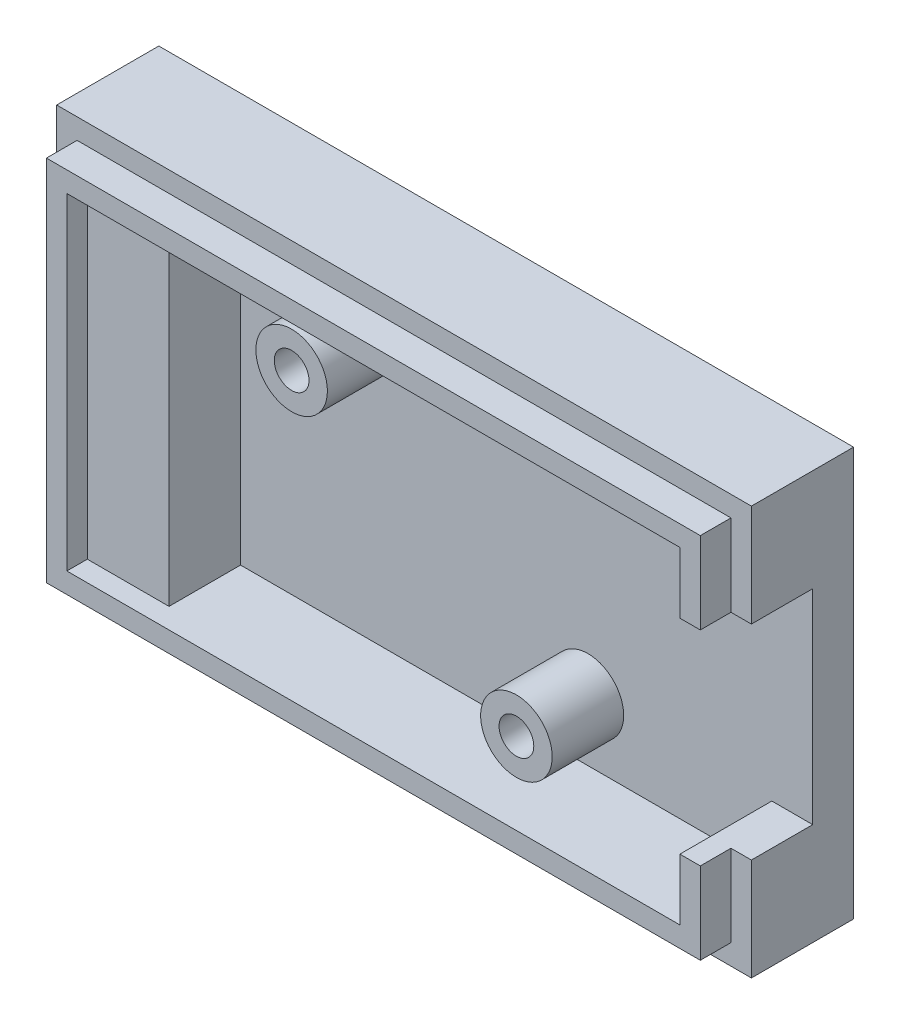
ISO-10303-21;
HEADER;
FILE_DESCRIPTION(('STEP AP214'),'2;1');
FILE_NAME('part.step','',(''),(''),'','','');
FILE_SCHEMA(('AUTOMOTIVE_DESIGN { 1 0 10303 214 1 1 1 1 }'));
ENDSEC;
DATA;
#1=APPLICATION_CONTEXT('core data for automotive mechanical design processes');
#2=APPLICATION_PROTOCOL_DEFINITION('international standard','automotive_design',2000,#1);
#3=PRODUCT_CONTEXT('',#1,'mechanical');
#4=PRODUCT('Part','Part','',(#3));
#5=PRODUCT_RELATED_PRODUCT_CATEGORY('part','',(#4));
#6=PRODUCT_DEFINITION_FORMATION('','',#4);
#7=PRODUCT_DEFINITION_CONTEXT('part definition',#1,'design');
#8=PRODUCT_DEFINITION('design','',#6,#7);
#9=PRODUCT_DEFINITION_SHAPE('','',#8);
#10=(LENGTH_UNIT() NAMED_UNIT(*) SI_UNIT(.MILLI.,.METRE.));
#11=(NAMED_UNIT(*) PLANE_ANGLE_UNIT() SI_UNIT($,.RADIAN.));
#12=(NAMED_UNIT(*) SI_UNIT($,.STERADIAN.) SOLID_ANGLE_UNIT());
#13=UNCERTAINTY_MEASURE_WITH_UNIT(LENGTH_MEASURE(1.E-05),#10,'distance_accuracy_value','');
#14=(GEOMETRIC_REPRESENTATION_CONTEXT(3) GLOBAL_UNCERTAINTY_ASSIGNED_CONTEXT((#13)) GLOBAL_UNIT_ASSIGNED_CONTEXT((#10,
#11,#12)) REPRESENTATION_CONTEXT('',''));
#15=CARTESIAN_POINT('',(0.,0.,0.));
#16=DIRECTION('',(0.,0.,1.));
#17=DIRECTION('',(1.,0.,0.));
#18=AXIS2_PLACEMENT_3D('',#15,#16,#17);
#19=CARTESIAN_POINT('',(6.,-5.,0.));
#20=DIRECTION('',(0.,0.,1.));
#21=DIRECTION('',(1.,0.,0.));
#22=AXIS2_PLACEMENT_3D('',#19,#20,#21);
#23=CYLINDRICAL_SURFACE('',#22,0.85);
#24=CARTESIAN_POINT('',(6.,-5.,5.5));
#25=DIRECTION('',(0.,0.,1.));
#26=DIRECTION('',(1.,0.,0.));
#27=AXIS2_PLACEMENT_3D('',#24,#25,#26);
#28=CIRCLE('',#27,0.85);
#29=CARTESIAN_POINT('',(6.85,-5.,5.5));
#30=VERTEX_POINT('',#29);
#31=EDGE_CURVE('E250',#30,#30,#28,.T.);
#32=ORIENTED_EDGE('',*,*,#31,.T.);
#33=EDGE_LOOP('',(#32));
#34=FACE_BOUND('',#33,.T.);
#35=CARTESIAN_POINT('',(6.,-5.,1.));
#36=DIRECTION('',(0.,0.,-1.));
#37=DIRECTION('',(-1.,0.,0.));
#38=AXIS2_PLACEMENT_3D('',#35,#36,#37);
#39=CIRCLE('',#38,0.85);
#40=CARTESIAN_POINT('',(5.15,-5.,1.));
#41=VERTEX_POINT('',#40);
#42=EDGE_CURVE('E42',#41,#41,#39,.F.);
#43=ORIENTED_EDGE('',*,*,#42,.F.);
#44=EDGE_LOOP('',(#43));
#45=FACE_BOUND('',#44,.T.);
#46=ADVANCED_FACE('F38',(#34,#45),#23,.F.);
#47=CARTESIAN_POINT('',(-5.,5.,0.));
#48=DIRECTION('',(0.,0.,1.));
#49=DIRECTION('',(1.,0.,0.));
#50=AXIS2_PLACEMENT_3D('',#47,#48,#49);
#51=CYLINDRICAL_SURFACE('',#50,0.85);
#52=CARTESIAN_POINT('',(-5.,5.,5.5));
#53=DIRECTION('',(0.,0.,1.));
#54=DIRECTION('',(1.,0.,0.));
#55=AXIS2_PLACEMENT_3D('',#52,#53,#54);
#56=CIRCLE('',#55,0.85);
#57=CARTESIAN_POINT('',(-4.15,5.,5.5));
#58=VERTEX_POINT('',#57);
#59=EDGE_CURVE('E268',#58,#58,#56,.T.);
#60=ORIENTED_EDGE('',*,*,#59,.T.);
#61=EDGE_LOOP('',(#60));
#62=FACE_BOUND('',#61,.T.);
#63=CARTESIAN_POINT('',(-5.,5.,1.));
#64=DIRECTION('',(0.,0.,-1.));
#65=DIRECTION('',(-1.,0.,0.));
#66=AXIS2_PLACEMENT_3D('',#63,#64,#65);
#67=CIRCLE('',#66,0.85);
#68=CARTESIAN_POINT('',(-5.85,5.,1.));
#69=VERTEX_POINT('',#68);
#70=EDGE_CURVE('E241',#69,#69,#67,.F.);
#71=ORIENTED_EDGE('',*,*,#70,.F.);
#72=EDGE_LOOP('',(#71));
#73=FACE_BOUND('',#72,.T.);
#74=ADVANCED_FACE('F492',(#62,#73),#51,.F.);
#75=CARTESIAN_POINT('',(-15.,-8.,2.));
#76=DIRECTION('',(0.,-1.,0.));
#77=DIRECTION('',(0.,0.,-1.));
#78=AXIS2_PLACEMENT_3D('',#75,#76,#77);
#79=PLANE('',#78);
#80=DIRECTION('',(0.,0.,-1.));
#81=VECTOR('',#80,1.);
#82=CARTESIAN_POINT('',(-11.,-8.,5.5));
#83=LINE('',#82,#81);
#84=CARTESIAN_POINT('',(-11.,-8.,5.5));
#85=VERTEX_POINT('',#84);
#86=CARTESIAN_POINT('',(-11.,-8.,2.));
#87=VERTEX_POINT('',#86);
#88=EDGE_CURVE('E56',#85,#87,#83,.T.);
#89=ORIENTED_EDGE('',*,*,#88,.F.);
#90=DIRECTION('',(1.,0.,0.));
#91=VECTOR('',#90,1.);
#92=CARTESIAN_POINT('',(-15.,-8.,5.5));
#93=LINE('',#92,#91);
#94=CARTESIAN_POINT('',(-15.,-8.,5.5));
#95=VERTEX_POINT('',#94);
#96=EDGE_CURVE('E181',#95,#85,#93,.T.);
#97=ORIENTED_EDGE('',*,*,#96,.F.);
#98=DIRECTION('',(0.,0.,1.));
#99=VECTOR('',#98,1.);
#100=CARTESIAN_POINT('',(-15.,-8.,2.));
#101=LINE('',#100,#99);
#102=CARTESIAN_POINT('',(-15.,-8.,6.5));
#103=VERTEX_POINT('',#102);
#104=EDGE_CURVE('E193',#95,#103,#101,.T.);
#105=ORIENTED_EDGE('',*,*,#104,.T.);
#106=DIRECTION('',(1.,0.,0.));
#107=VECTOR('',#106,1.);
#108=CARTESIAN_POINT('',(-15.,-8.,6.5));
#109=LINE('',#108,#107);
#110=CARTESIAN_POINT('',(15.,-8.,6.5));
#111=VERTEX_POINT('',#110);
#112=EDGE_CURVE('E436',#103,#111,#109,.T.);
#113=ORIENTED_EDGE('',*,*,#112,.T.);
#114=DIRECTION('',(0.,0.,1.));
#115=VECTOR('',#114,1.);
#116=CARTESIAN_POINT('',(15.,-8.,2.));
#117=LINE('',#116,#115);
#118=CARTESIAN_POINT('',(15.,-8.,2.));
#119=VERTEX_POINT('',#118);
#120=EDGE_CURVE('E204',#119,#111,#117,.T.);
#121=ORIENTED_EDGE('',*,*,#120,.F.);
#122=DIRECTION('',(1.,0.,0.));
#123=VECTOR('',#122,1.);
#124=CARTESIAN_POINT('',(-15.,-8.,2.));
#125=LINE('',#124,#123);
#126=EDGE_CURVE('E218',#87,#119,#125,.T.);
#127=ORIENTED_EDGE('',*,*,#126,.F.);
#128=EDGE_LOOP('',(#89,#97,#105,#113,#121,#127));
#129=FACE_BOUND('',#128,.T.);
#130=ADVANCED_FACE('F191',(#129),#79,.F.);
#131=CARTESIAN_POINT('',(-15.,8.,2.));
#132=DIRECTION('',(0.,1.,0.));
#133=DIRECTION('',(0.,0.,1.));
#134=AXIS2_PLACEMENT_3D('',#131,#132,#133);
#135=PLANE('',#134);
#136=DIRECTION('',(0.,0.,-1.));
#137=VECTOR('',#136,1.);
#138=CARTESIAN_POINT('',(-11.,8.,5.5));
#139=LINE('',#138,#137);
#140=CARTESIAN_POINT('',(-11.,8.,5.5));
#141=VERTEX_POINT('',#140);
#142=CARTESIAN_POINT('',(-11.,8.,2.));
#143=VERTEX_POINT('',#142);
#144=EDGE_CURVE('E295',#141,#143,#139,.T.);
#145=ORIENTED_EDGE('',*,*,#144,.T.);
#146=DIRECTION('',(-1.,0.,0.));
#147=VECTOR('',#146,1.);
#148=CARTESIAN_POINT('',(-15.,8.,2.));
#149=LINE('',#148,#147);
#150=CARTESIAN_POINT('',(15.,8.,2.));
#151=VERTEX_POINT('',#150);
#152=EDGE_CURVE('E420',#151,#143,#149,.T.);
#153=ORIENTED_EDGE('',*,*,#152,.F.);
#154=DIRECTION('',(0.,0.,1.));
#155=VECTOR('',#154,1.);
#156=CARTESIAN_POINT('',(15.,8.,2.));
#157=LINE('',#156,#155);
#158=CARTESIAN_POINT('',(15.,8.,6.5));
#159=VERTEX_POINT('',#158);
#160=EDGE_CURVE('E211',#151,#159,#157,.T.);
#161=ORIENTED_EDGE('',*,*,#160,.T.);
#162=DIRECTION('',(-1.,0.,0.));
#163=VECTOR('',#162,1.);
#164=CARTESIAN_POINT('',(-15.,8.,6.5));
#165=LINE('',#164,#163);
#166=CARTESIAN_POINT('',(-15.,8.,6.5));
#167=VERTEX_POINT('',#166);
#168=EDGE_CURVE('E431',#159,#167,#165,.T.);
#169=ORIENTED_EDGE('',*,*,#168,.T.);
#170=DIRECTION('',(0.,0.,1.));
#171=VECTOR('',#170,1.);
#172=CARTESIAN_POINT('',(-15.,8.,2.));
#173=LINE('',#172,#171);
#174=CARTESIAN_POINT('',(-15.,8.,5.5));
#175=VERTEX_POINT('',#174);
#176=EDGE_CURVE('E205',#175,#167,#173,.T.);
#177=ORIENTED_EDGE('',*,*,#176,.F.);
#178=DIRECTION('',(-1.,0.,0.));
#179=VECTOR('',#178,1.);
#180=CARTESIAN_POINT('',(-15.,8.,5.5));
#181=LINE('',#180,#179);
#182=EDGE_CURVE('E183',#141,#175,#181,.T.);
#183=ORIENTED_EDGE('',*,*,#182,.F.);
#184=EDGE_LOOP('',(#145,#153,#161,#169,#177,#183));
#185=FACE_BOUND('',#184,.T.);
#186=ADVANCED_FACE('F452',(#185),#135,.F.);
#187=CARTESIAN_POINT('',(0.,0.,2.));
#188=DIRECTION('',(0.,0.,1.));
#189=DIRECTION('',(1.,0.,0.));
#190=AXIS2_PLACEMENT_3D('',#187,#188,#189);
#191=PLANE('',#190);
#192=CARTESIAN_POINT('',(6.,-5.,2.));
#193=DIRECTION('',(0.,0.,1.));
#194=DIRECTION('',(1.,0.,0.));
#195=AXIS2_PLACEMENT_3D('',#192,#193,#194);
#196=CIRCLE('',#195,1.75);
#197=CARTESIAN_POINT('',(7.75,-5.,2.));
#198=VERTEX_POINT('',#197);
#199=EDGE_CURVE('E272',#198,#198,#196,.T.);
#200=ORIENTED_EDGE('',*,*,#199,.F.);
#201=EDGE_LOOP('',(#200));
#202=FACE_BOUND('',#201,.T.);
#203=CARTESIAN_POINT('',(-5.,5.,2.));
#204=DIRECTION('',(0.,0.,1.));
#205=DIRECTION('',(1.,0.,0.));
#206=AXIS2_PLACEMENT_3D('',#203,#204,#205);
#207=CIRCLE('',#206,1.75);
#208=CARTESIAN_POINT('',(-3.25,5.,2.));
#209=VERTEX_POINT('',#208);
#210=EDGE_CURVE('E280',#209,#209,#207,.T.);
#211=ORIENTED_EDGE('',*,*,#210,.F.);
#212=EDGE_LOOP('',(#211));
#213=FACE_BOUND('',#212,.T.);
#214=ORIENTED_EDGE('',*,*,#152,.T.);
#215=DIRECTION('',(0.,1.,0.));
#216=VECTOR('',#215,1.);
#217=CARTESIAN_POINT('',(-11.,8.,2.));
#218=LINE('',#217,#216);
#219=EDGE_CURVE('E188',#87,#143,#218,.T.);
#220=ORIENTED_EDGE('',*,*,#219,.F.);
#221=ORIENTED_EDGE('',*,*,#126,.T.);
#222=DIRECTION('',(0.,1.,0.));
#223=VECTOR('',#222,1.);
#224=CARTESIAN_POINT('',(15.,8.,2.));
#225=LINE('',#224,#223);
#226=CARTESIAN_POINT('',(15.,-5.,2.));
#227=VERTEX_POINT('',#226);
#228=EDGE_CURVE('E416',#119,#227,#225,.T.);
#229=ORIENTED_EDGE('',*,*,#228,.T.);
#230=DIRECTION('',(1.,0.,0.));
#231=VECTOR('',#230,1.);
#232=CARTESIAN_POINT('',(15.,-5.,2.));
#233=LINE('',#232,#231);
#234=CARTESIAN_POINT('',(17.,-5.,2.));
#235=VERTEX_POINT('',#234);
#236=EDGE_CURVE('E409',#227,#235,#233,.T.);
#237=ORIENTED_EDGE('',*,*,#236,.T.);
#238=DIRECTION('',(0.,1.,0.));
#239=VECTOR('',#238,1.);
#240=CARTESIAN_POINT('',(17.,5.,2.));
#241=LINE('',#240,#239);
#242=CARTESIAN_POINT('',(17.,5.,2.));
#243=VERTEX_POINT('',#242);
#244=EDGE_CURVE('E394',#235,#243,#241,.T.);
#245=ORIENTED_EDGE('',*,*,#244,.T.);
#246=DIRECTION('',(1.,0.,0.));
#247=VECTOR('',#246,1.);
#248=CARTESIAN_POINT('',(15.,5.,2.));
#249=LINE('',#248,#247);
#250=CARTESIAN_POINT('',(15.,5.,2.));
#251=VERTEX_POINT('',#250);
#252=EDGE_CURVE('E406',#251,#243,#249,.T.);
#253=ORIENTED_EDGE('',*,*,#252,.F.);
#254=EDGE_CURVE('E421',#251,#151,#225,.T.);
#255=ORIENTED_EDGE('',*,*,#254,.T.);
#256=EDGE_LOOP('',(#214,#220,#221,#229,#237,#245,#253,#255));
#257=FACE_BOUND('',#256,.T.);
#258=ADVANCED_FACE('F445',(#202,#213,#257),#191,.T.);
#259=CARTESIAN_POINT('',(15.,8.,2.));
#260=DIRECTION('',(1.,0.,0.));
#261=DIRECTION('',(0.,0.,-1.));
#262=AXIS2_PLACEMENT_3D('',#259,#260,#261);
#263=PLANE('',#262);
#264=ORIENTED_EDGE('',*,*,#254,.F.);
#265=DIRECTION('',(0.,0.,1.));
#266=VECTOR('',#265,1.);
#267=CARTESIAN_POINT('',(15.,5.,6.5));
#268=LINE('',#267,#266);
#269=CARTESIAN_POINT('',(15.,5.,6.5));
#270=VERTEX_POINT('',#269);
#271=EDGE_CURVE('E386',#251,#270,#268,.T.);
#272=ORIENTED_EDGE('',*,*,#271,.T.);
#273=DIRECTION('',(0.,1.,0.));
#274=VECTOR('',#273,1.);
#275=CARTESIAN_POINT('',(15.,8.,6.5));
#276=LINE('',#275,#274);
#277=EDGE_CURVE('E405',#270,#159,#276,.T.);
#278=ORIENTED_EDGE('',*,*,#277,.T.);
#279=ORIENTED_EDGE('',*,*,#160,.F.);
#280=EDGE_LOOP('',(#264,#272,#278,#279));
#281=FACE_BOUND('',#280,.T.);
#282=ADVANCED_FACE('F448',(#281),#263,.F.);
#283=CARTESIAN_POINT('',(17.,10.,6.5));
#284=DIRECTION('',(-1.,0.,0.));
#285=DIRECTION('',(0.,0.,1.));
#286=AXIS2_PLACEMENT_3D('',#283,#284,#285);
#287=PLANE('',#286);
#288=DIRECTION('',(0.,0.,-1.));
#289=VECTOR('',#288,1.);
#290=CARTESIAN_POINT('',(17.,10.,6.5));
#291=LINE('',#290,#289);
#292=CARTESIAN_POINT('',(17.,10.,5.));
#293=VERTEX_POINT('',#292);
#294=CARTESIAN_POINT('',(17.,10.,0.));
#295=VERTEX_POINT('',#294);
#296=EDGE_CURVE('E11',#293,#295,#291,.T.);
#297=ORIENTED_EDGE('',*,*,#296,.F.);
#298=DIRECTION('',(0.,1.,0.));
#299=VECTOR('',#298,1.);
#300=CARTESIAN_POINT('',(17.,10.,5.));
#301=LINE('',#300,#299);
#302=CARTESIAN_POINT('',(17.,5.,5.));
#303=VERTEX_POINT('',#302);
#304=EDGE_CURVE('E307',#303,#293,#301,.T.);
#305=ORIENTED_EDGE('',*,*,#304,.F.);
#306=DIRECTION('',(0.,0.,1.));
#307=VECTOR('',#306,1.);
#308=CARTESIAN_POINT('',(17.,5.,6.5));
#309=LINE('',#308,#307);
#310=EDGE_CURVE('E387',#243,#303,#309,.T.);
#311=ORIENTED_EDGE('',*,*,#310,.F.);
#312=ORIENTED_EDGE('',*,*,#244,.F.);
#313=DIRECTION('',(0.,0.,-1.));
#314=VECTOR('',#313,1.);
#315=CARTESIAN_POINT('',(17.,-5.,6.5));
#316=LINE('',#315,#314);
#317=CARTESIAN_POINT('',(17.,-5.,5.));
#318=VERTEX_POINT('',#317);
#319=EDGE_CURVE('E367',#318,#235,#316,.T.);
#320=ORIENTED_EDGE('',*,*,#319,.F.);
#321=DIRECTION('',(0.,1.,0.));
#322=VECTOR('',#321,1.);
#323=CARTESIAN_POINT('',(17.,-5.,5.));
#324=LINE('',#323,#322);
#325=CARTESIAN_POINT('',(17.,-10.,5.));
#326=VERTEX_POINT('',#325);
#327=EDGE_CURVE('E64',#326,#318,#324,.T.);
#328=ORIENTED_EDGE('',*,*,#327,.F.);
#329=DIRECTION('',(0.,0.,-1.));
#330=VECTOR('',#329,1.);
#331=CARTESIAN_POINT('',(17.,-10.,6.5));
#332=LINE('',#331,#330);
#333=CARTESIAN_POINT('',(17.,-10.,0.));
#334=VERTEX_POINT('',#333);
#335=EDGE_CURVE('E234',#326,#334,#332,.T.);
#336=ORIENTED_EDGE('',*,*,#335,.T.);
#337=DIRECTION('',(0.,1.,0.));
#338=VECTOR('',#337,1.);
#339=CARTESIAN_POINT('',(17.,10.,0.));
#340=LINE('',#339,#338);
#341=EDGE_CURVE('E209',#334,#295,#340,.T.);
#342=ORIENTED_EDGE('',*,*,#341,.T.);
#343=EDGE_LOOP('',(#297,#305,#311,#312,#320,#328,#336,#342));
#344=FACE_BOUND('',#343,.T.);
#345=ADVANCED_FACE('F40',(#344),#287,.F.);
#346=CARTESIAN_POINT('',(-17.,10.,6.5));
#347=DIRECTION('',(0.,-1.,0.));
#348=DIRECTION('',(0.,0.,-1.));
#349=AXIS2_PLACEMENT_3D('',#346,#347,#348);
#350=PLANE('',#349);
#351=DIRECTION('',(0.,0.,-1.));
#352=VECTOR('',#351,1.);
#353=CARTESIAN_POINT('',(-17.,10.,6.5));
#354=LINE('',#353,#352);
#355=CARTESIAN_POINT('',(-17.,10.,5.));
#356=VERTEX_POINT('',#355);
#357=CARTESIAN_POINT('',(-17.,10.,0.));
#358=VERTEX_POINT('',#357);
#359=EDGE_CURVE('E48',#356,#358,#354,.T.);
#360=ORIENTED_EDGE('',*,*,#359,.F.);
#361=DIRECTION('',(-1.,0.,0.));
#362=VECTOR('',#361,1.);
#363=CARTESIAN_POINT('',(-17.,10.,5.));
#364=LINE('',#363,#362);
#365=EDGE_CURVE('E311',#293,#356,#364,.T.);
#366=ORIENTED_EDGE('',*,*,#365,.F.);
#367=ORIENTED_EDGE('',*,*,#296,.T.);
#368=DIRECTION('',(-1.,0.,0.));
#369=VECTOR('',#368,1.);
#370=CARTESIAN_POINT('',(-17.,10.,0.));
#371=LINE('',#370,#369);
#372=EDGE_CURVE('E222',#295,#358,#371,.T.);
#373=ORIENTED_EDGE('',*,*,#372,.T.);
#374=EDGE_LOOP('',(#360,#366,#367,#373));
#375=FACE_BOUND('',#374,.T.);
#376=ADVANCED_FACE('F614',(#375),#350,.F.);
#377=CARTESIAN_POINT('',(-17.,10.,6.5));
#378=DIRECTION('',(1.,0.,0.));
#379=DIRECTION('',(0.,0.,-1.));
#380=AXIS2_PLACEMENT_3D('',#377,#378,#379);
#381=PLANE('',#380);
#382=DIRECTION('',(0.,0.,-1.));
#383=VECTOR('',#382,1.);
#384=CARTESIAN_POINT('',(-17.,-10.,6.5));
#385=LINE('',#384,#383);
#386=CARTESIAN_POINT('',(-17.,-10.,5.));
#387=VERTEX_POINT('',#386);
#388=CARTESIAN_POINT('',(-17.,-10.,0.));
#389=VERTEX_POINT('',#388);
#390=EDGE_CURVE('E237',#387,#389,#385,.T.);
#391=ORIENTED_EDGE('',*,*,#390,.F.);
#392=DIRECTION('',(0.,-1.,0.));
#393=VECTOR('',#392,1.);
#394=CARTESIAN_POINT('',(-17.,-10.,5.));
#395=LINE('',#394,#393);
#396=EDGE_CURVE('E314',#356,#387,#395,.T.);
#397=ORIENTED_EDGE('',*,*,#396,.F.);
#398=ORIENTED_EDGE('',*,*,#359,.T.);
#399=DIRECTION('',(0.,-1.,0.));
#400=VECTOR('',#399,1.);
#401=CARTESIAN_POINT('',(-17.,10.,0.));
#402=LINE('',#401,#400);
#403=EDGE_CURVE('E226',#358,#389,#402,.T.);
#404=ORIENTED_EDGE('',*,*,#403,.T.);
#405=EDGE_LOOP('',(#391,#397,#398,#404));
#406=FACE_BOUND('',#405,.T.);
#407=ADVANCED_FACE('F610',(#406),#381,.F.);
#408=CARTESIAN_POINT('',(-17.,-10.,6.5));
#409=DIRECTION('',(0.,1.,0.));
#410=DIRECTION('',(0.,0.,1.));
#411=AXIS2_PLACEMENT_3D('',#408,#409,#410);
#412=PLANE('',#411);
#413=ORIENTED_EDGE('',*,*,#335,.F.);
#414=DIRECTION('',(1.,0.,0.));
#415=VECTOR('',#414,1.);
#416=CARTESIAN_POINT('',(17.,-10.,5.));
#417=LINE('',#416,#415);
#418=EDGE_CURVE('E317',#387,#326,#417,.T.);
#419=ORIENTED_EDGE('',*,*,#418,.F.);
#420=ORIENTED_EDGE('',*,*,#390,.T.);
#421=DIRECTION('',(1.,0.,0.));
#422=VECTOR('',#421,1.);
#423=CARTESIAN_POINT('',(-17.,-10.,0.));
#424=LINE('',#423,#422);
#425=EDGE_CURVE('E230',#389,#334,#424,.T.);
#426=ORIENTED_EDGE('',*,*,#425,.T.);
#427=EDGE_LOOP('',(#413,#419,#420,#426));
#428=FACE_BOUND('',#427,.T.);
#429=ADVANCED_FACE('F606',(#428),#412,.F.);
#430=CARTESIAN_POINT('',(0.,0.,6.5));
#431=DIRECTION('',(0.,0.,1.));
#432=DIRECTION('',(1.,0.,0.));
#433=AXIS2_PLACEMENT_3D('',#430,#431,#432);
#434=PLANE('',#433);
#435=DIRECTION('',(0.,-1.,0.));
#436=VECTOR('',#435,1.);
#437=CARTESIAN_POINT('',(16.,5.,6.5));
#438=LINE('',#437,#436);
#439=CARTESIAN_POINT('',(16.,9.,6.5));
#440=VERTEX_POINT('',#439);
#441=CARTESIAN_POINT('',(16.,5.,6.5));
#442=VERTEX_POINT('',#441);
#443=EDGE_CURVE('E308',#440,#442,#438,.T.);
#444=ORIENTED_EDGE('',*,*,#443,.F.);
#445=DIRECTION('',(1.,0.,0.));
#446=VECTOR('',#445,1.);
#447=CARTESIAN_POINT('',(16.,9.,6.5));
#448=LINE('',#447,#446);
#449=CARTESIAN_POINT('',(-16.,9.,6.5));
#450=VERTEX_POINT('',#449);
#451=EDGE_CURVE('E357',#450,#440,#448,.T.);
#452=ORIENTED_EDGE('',*,*,#451,.F.);
#453=DIRECTION('',(0.,1.,0.));
#454=VECTOR('',#453,1.);
#455=CARTESIAN_POINT('',(-16.,9.,6.5));
#456=LINE('',#455,#454);
#457=CARTESIAN_POINT('',(-16.,-9.00000000000001,6.5));
#458=VERTEX_POINT('',#457);
#459=EDGE_CURVE('E353',#458,#450,#456,.T.);
#460=ORIENTED_EDGE('',*,*,#459,.F.);
#461=DIRECTION('',(-1.,0.,0.));
#462=VECTOR('',#461,1.);
#463=CARTESIAN_POINT('',(-16.,-9.00000000000001,6.5));
#464=LINE('',#463,#462);
#465=CARTESIAN_POINT('',(16.,-9.00000000000001,6.5));
#466=VERTEX_POINT('',#465);
#467=EDGE_CURVE('E349',#466,#458,#464,.T.);
#468=ORIENTED_EDGE('',*,*,#467,.F.);
#469=DIRECTION('',(0.,-1.,0.));
#470=VECTOR('',#469,1.);
#471=CARTESIAN_POINT('',(16.,-9.00000000000001,6.5));
#472=LINE('',#471,#470);
#473=CARTESIAN_POINT('',(16.,-5.,6.5));
#474=VERTEX_POINT('',#473);
#475=EDGE_CURVE('E303',#474,#466,#472,.T.);
#476=ORIENTED_EDGE('',*,*,#475,.F.);
#477=DIRECTION('',(1.,0.,0.));
#478=VECTOR('',#477,1.);
#479=CARTESIAN_POINT('',(15.,-5.,6.5));
#480=LINE('',#479,#478);
#481=CARTESIAN_POINT('',(15.,-5.,6.5));
#482=VERTEX_POINT('',#481);
#483=EDGE_CURVE('E391',#482,#474,#480,.T.);
#484=ORIENTED_EDGE('',*,*,#483,.F.);
#485=EDGE_CURVE('E427',#111,#482,#276,.T.);
#486=ORIENTED_EDGE('',*,*,#485,.F.);
#487=ORIENTED_EDGE('',*,*,#112,.F.);
#488=DIRECTION('',(0.,-1.,0.));
#489=VECTOR('',#488,1.);
#490=CARTESIAN_POINT('',(-15.,8.,6.5));
#491=LINE('',#490,#489);
#492=EDGE_CURVE('E201',#167,#103,#491,.T.);
#493=ORIENTED_EDGE('',*,*,#492,.F.);
#494=ORIENTED_EDGE('',*,*,#168,.F.);
#495=ORIENTED_EDGE('',*,*,#277,.F.);
#496=DIRECTION('',(1.,0.,0.));
#497=VECTOR('',#496,1.);
#498=CARTESIAN_POINT('',(15.,5.,6.5));
#499=LINE('',#498,#497);
#500=EDGE_CURVE('E401',#270,#442,#499,.T.);
#501=ORIENTED_EDGE('',*,*,#500,.T.);
#502=EDGE_LOOP('',(#444,#452,#460,#468,#476,#484,#486,#487,#493,#494,#495,#501));
#503=FACE_BOUND('',#502,.T.);
#504=ADVANCED_FACE('F470',(#503),#434,.T.);
#505=CARTESIAN_POINT('',(0.,0.,0.));
#506=DIRECTION('',(0.,0.,1.));
#507=DIRECTION('',(1.,0.,0.));
#508=AXIS2_PLACEMENT_3D('',#505,#506,#507);
#509=PLANE('',#508);
#510=CARTESIAN_POINT('',(6.,-5.,0.));
#511=DIRECTION('',(0.,0.,-1.));
#512=DIRECTION('',(-1.,0.,0.));
#513=AXIS2_PLACEMENT_3D('',#510,#511,#512);
#514=CIRCLE('',#513,1.5);
#515=CARTESIAN_POINT('',(4.5,-5.,0.));
#516=VERTEX_POINT('',#515);
#517=EDGE_CURVE('E252',#516,#516,#514,.T.);
#518=ORIENTED_EDGE('',*,*,#517,.F.);
#519=EDGE_LOOP('',(#518));
#520=FACE_BOUND('',#519,.T.);
#521=CARTESIAN_POINT('',(-5.,5.,0.));
#522=DIRECTION('',(0.,0.,-1.));
#523=DIRECTION('',(-1.,0.,0.));
#524=AXIS2_PLACEMENT_3D('',#521,#522,#523);
#525=CIRCLE('',#524,1.5);
#526=CARTESIAN_POINT('',(-6.5,5.,0.));
#527=VERTEX_POINT('',#526);
#528=EDGE_CURVE('E264',#527,#527,#525,.T.);
#529=ORIENTED_EDGE('',*,*,#528,.F.);
#530=EDGE_LOOP('',(#529));
#531=FACE_BOUND('',#530,.T.);
#532=ORIENTED_EDGE('',*,*,#341,.F.);
#533=ORIENTED_EDGE('',*,*,#425,.F.);
#534=ORIENTED_EDGE('',*,*,#403,.F.);
#535=ORIENTED_EDGE('',*,*,#372,.F.);
#536=EDGE_LOOP('',(#532,#533,#534,#535));
#537=FACE_BOUND('',#536,.T.);
#538=ADVANCED_FACE('F594',(#520,#531,#537),#509,.F.);
#539=ORIENTED_EDGE('',*,*,#485,.T.);
#540=DIRECTION('',(0.,0.,-1.));
#541=VECTOR('',#540,1.);
#542=CARTESIAN_POINT('',(15.,-5.,6.5));
#543=LINE('',#542,#541);
#544=EDGE_CURVE('E382',#482,#227,#543,.T.);
#545=ORIENTED_EDGE('',*,*,#544,.T.);
#546=ORIENTED_EDGE('',*,*,#228,.F.);
#547=ORIENTED_EDGE('',*,*,#120,.T.);
#548=EDGE_LOOP('',(#539,#545,#546,#547));
#549=FACE_BOUND('',#548,.T.);
#550=ADVANCED_FACE('F457',(#549),#263,.F.);
#551=CARTESIAN_POINT('',(-15.,8.,2.));
#552=DIRECTION('',(-1.,0.,0.));
#553=DIRECTION('',(0.,0.,1.));
#554=AXIS2_PLACEMENT_3D('',#551,#552,#553);
#555=PLANE('',#554);
#556=ORIENTED_EDGE('',*,*,#104,.F.);
#557=DIRECTION('',(0.,-1.,0.));
#558=VECTOR('',#557,1.);
#559=CARTESIAN_POINT('',(-15.,8.,5.5));
#560=LINE('',#559,#558);
#561=EDGE_CURVE('E178',#175,#95,#560,.T.);
#562=ORIENTED_EDGE('',*,*,#561,.F.);
#563=ORIENTED_EDGE('',*,*,#176,.T.);
#564=ORIENTED_EDGE('',*,*,#492,.T.);
#565=EDGE_LOOP('',(#556,#562,#563,#564));
#566=FACE_BOUND('',#565,.T.);
#567=ADVANCED_FACE('F199',(#566),#555,.F.);
#568=CARTESIAN_POINT('',(15.,5.,6.5));
#569=DIRECTION('',(0.,1.,0.));
#570=DIRECTION('',(0.,0.,1.));
#571=AXIS2_PLACEMENT_3D('',#568,#569,#570);
#572=PLANE('',#571);
#573=DIRECTION('',(1.,0.,0.));
#574=VECTOR('',#573,1.);
#575=CARTESIAN_POINT('',(17.,5.,5.));
#576=LINE('',#575,#574);
#577=CARTESIAN_POINT('',(16.,5.,5.));
#578=VERTEX_POINT('',#577);
#579=EDGE_CURVE('E304',#578,#303,#576,.T.);
#580=ORIENTED_EDGE('',*,*,#579,.F.);
#581=DIRECTION('',(0.,0.,1.));
#582=VECTOR('',#581,1.);
#583=CARTESIAN_POINT('',(16.,5.,5.));
#584=LINE('',#583,#582);
#585=EDGE_CURVE('E363',#578,#442,#584,.T.);
#586=ORIENTED_EDGE('',*,*,#585,.T.);
#587=ORIENTED_EDGE('',*,*,#500,.F.);
#588=ORIENTED_EDGE('',*,*,#271,.F.);
#589=ORIENTED_EDGE('',*,*,#252,.T.);
#590=ORIENTED_EDGE('',*,*,#310,.T.);
#591=EDGE_LOOP('',(#580,#586,#587,#588,#589,#590));
#592=FACE_BOUND('',#591,.T.);
#593=ADVANCED_FACE('F467',(#592),#572,.F.);
#594=CARTESIAN_POINT('',(15.,-5.,6.5));
#595=DIRECTION('',(0.,-1.,0.));
#596=DIRECTION('',(0.,0.,-1.));
#597=AXIS2_PLACEMENT_3D('',#594,#595,#596);
#598=PLANE('',#597);
#599=ORIENTED_EDGE('',*,*,#483,.T.);
#600=DIRECTION('',(0.,0.,1.));
#601=VECTOR('',#600,1.);
#602=CARTESIAN_POINT('',(16.,-5.,5.));
#603=LINE('',#602,#601);
#604=CARTESIAN_POINT('',(16.,-5.,5.));
#605=VERTEX_POINT('',#604);
#606=EDGE_CURVE('E345',#605,#474,#603,.T.);
#607=ORIENTED_EDGE('',*,*,#606,.F.);
#608=DIRECTION('',(-1.,0.,0.));
#609=VECTOR('',#608,1.);
#610=CARTESIAN_POINT('',(16.,-5.,5.));
#611=LINE('',#610,#609);
#612=EDGE_CURVE('E322',#318,#605,#611,.T.);
#613=ORIENTED_EDGE('',*,*,#612,.F.);
#614=ORIENTED_EDGE('',*,*,#319,.T.);
#615=ORIENTED_EDGE('',*,*,#236,.F.);
#616=ORIENTED_EDGE('',*,*,#544,.F.);
#617=EDGE_LOOP('',(#599,#607,#613,#614,#615,#616));
#618=FACE_BOUND('',#617,.T.);
#619=ADVANCED_FACE('F476',(#618),#598,.F.);
#620=CARTESIAN_POINT('',(16.,5.,5.));
#621=DIRECTION('',(-1.,0.,0.));
#622=DIRECTION('',(0.,0.,1.));
#623=AXIS2_PLACEMENT_3D('',#620,#621,#622);
#624=PLANE('',#623);
#625=ORIENTED_EDGE('',*,*,#443,.T.);
#626=ORIENTED_EDGE('',*,*,#585,.F.);
#627=DIRECTION('',(0.,-1.,0.));
#628=VECTOR('',#627,1.);
#629=CARTESIAN_POINT('',(16.,5.,5.));
#630=LINE('',#629,#628);
#631=CARTESIAN_POINT('',(16.,9.,5.));
#632=VERTEX_POINT('',#631);
#633=EDGE_CURVE('E341',#632,#578,#630,.T.);
#634=ORIENTED_EDGE('',*,*,#633,.F.);
#635=DIRECTION('',(0.,0.,1.));
#636=VECTOR('',#635,1.);
#637=CARTESIAN_POINT('',(16.,9.,5.));
#638=LINE('',#637,#636);
#639=EDGE_CURVE('E368',#632,#440,#638,.T.);
#640=ORIENTED_EDGE('',*,*,#639,.T.);
#641=EDGE_LOOP('',(#625,#626,#634,#640));
#642=FACE_BOUND('',#641,.T.);
#643=ADVANCED_FACE('F639',(#642),#624,.F.);
#644=CARTESIAN_POINT('',(16.,9.,5.));
#645=DIRECTION('',(0.,-1.,0.));
#646=DIRECTION('',(1.,0.,0.));
#647=AXIS2_PLACEMENT_3D('',#644,#645,#646);
#648=PLANE('',#647);
#649=ORIENTED_EDGE('',*,*,#451,.T.);
#650=ORIENTED_EDGE('',*,*,#639,.F.);
#651=DIRECTION('',(1.,0.,0.));
#652=VECTOR('',#651,1.);
#653=CARTESIAN_POINT('',(16.,9.,5.));
#654=LINE('',#653,#652);
#655=CARTESIAN_POINT('',(-16.,9.,5.));
#656=VERTEX_POINT('',#655);
#657=EDGE_CURVE('E337',#656,#632,#654,.T.);
#658=ORIENTED_EDGE('',*,*,#657,.F.);
#659=DIRECTION('',(0.,0.,1.));
#660=VECTOR('',#659,1.);
#661=CARTESIAN_POINT('',(-16.,9.,5.));
#662=LINE('',#661,#660);
#663=EDGE_CURVE('E371',#656,#450,#662,.T.);
#664=ORIENTED_EDGE('',*,*,#663,.T.);
#665=EDGE_LOOP('',(#649,#650,#658,#664));
#666=FACE_BOUND('',#665,.T.);
#667=ADVANCED_FACE('F648',(#666),#648,.F.);
#668=CARTESIAN_POINT('',(-16.,9.,5.));
#669=DIRECTION('',(1.,0.,0.));
#670=DIRECTION('',(0.,1.,0.));
#671=AXIS2_PLACEMENT_3D('',#668,#669,#670);
#672=PLANE('',#671);
#673=ORIENTED_EDGE('',*,*,#459,.T.);
#674=ORIENTED_EDGE('',*,*,#663,.F.);
#675=DIRECTION('',(0.,1.,0.));
#676=VECTOR('',#675,1.);
#677=CARTESIAN_POINT('',(-16.,9.,5.));
#678=LINE('',#677,#676);
#679=CARTESIAN_POINT('',(-16.,-9.00000000000001,5.));
#680=VERTEX_POINT('',#679);
#681=EDGE_CURVE('E333',#680,#656,#678,.T.);
#682=ORIENTED_EDGE('',*,*,#681,.F.);
#683=DIRECTION('',(0.,0.,1.));
#684=VECTOR('',#683,1.);
#685=CARTESIAN_POINT('',(-16.,-9.00000000000001,5.));
#686=LINE('',#685,#684);
#687=EDGE_CURVE('E374',#680,#458,#686,.T.);
#688=ORIENTED_EDGE('',*,*,#687,.T.);
#689=EDGE_LOOP('',(#673,#674,#682,#688));
#690=FACE_BOUND('',#689,.T.);
#691=ADVANCED_FACE('F644',(#690),#672,.F.);
#692=CARTESIAN_POINT('',(-16.,-9.00000000000001,5.));
#693=DIRECTION('',(0.,1.,0.));
#694=DIRECTION('',(0.,0.,1.));
#695=AXIS2_PLACEMENT_3D('',#692,#693,#694);
#696=PLANE('',#695);
#697=ORIENTED_EDGE('',*,*,#467,.T.);
#698=ORIENTED_EDGE('',*,*,#687,.F.);
#699=DIRECTION('',(-1.,0.,0.));
#700=VECTOR('',#699,1.);
#701=CARTESIAN_POINT('',(-16.,-9.00000000000001,5.));
#702=LINE('',#701,#700);
#703=CARTESIAN_POINT('',(16.,-9.00000000000001,5.));
#704=VERTEX_POINT('',#703);
#705=EDGE_CURVE('E329',#704,#680,#702,.T.);
#706=ORIENTED_EDGE('',*,*,#705,.F.);
#707=DIRECTION('',(0.,0.,1.));
#708=VECTOR('',#707,1.);
#709=CARTESIAN_POINT('',(16.,-9.00000000000001,5.));
#710=LINE('',#709,#708);
#711=EDGE_CURVE('E377',#704,#466,#710,.T.);
#712=ORIENTED_EDGE('',*,*,#711,.T.);
#713=EDGE_LOOP('',(#697,#698,#706,#712));
#714=FACE_BOUND('',#713,.T.);
#715=ADVANCED_FACE('F488',(#714),#696,.F.);
#716=CARTESIAN_POINT('',(16.,-9.00000000000001,5.));
#717=DIRECTION('',(-1.,0.,0.));
#718=DIRECTION('',(0.,0.,1.));
#719=AXIS2_PLACEMENT_3D('',#716,#717,#718);
#720=PLANE('',#719);
#721=ORIENTED_EDGE('',*,*,#475,.T.);
#722=ORIENTED_EDGE('',*,*,#711,.F.);
#723=DIRECTION('',(0.,-1.,0.));
#724=VECTOR('',#723,1.);
#725=CARTESIAN_POINT('',(16.,-9.00000000000001,5.));
#726=LINE('',#725,#724);
#727=EDGE_CURVE('E325',#605,#704,#726,.T.);
#728=ORIENTED_EDGE('',*,*,#727,.F.);
#729=ORIENTED_EDGE('',*,*,#606,.T.);
#730=EDGE_LOOP('',(#721,#722,#728,#729));
#731=FACE_BOUND('',#730,.T.);
#732=ADVANCED_FACE('F478',(#731),#720,.F.);
#733=CARTESIAN_POINT('',(0.,0.,5.));
#734=DIRECTION('',(0.,0.,-1.));
#735=DIRECTION('',(-1.,0.,0.));
#736=AXIS2_PLACEMENT_3D('',#733,#734,#735);
#737=PLANE('',#736);
#738=ORIENTED_EDGE('',*,*,#579,.T.);
#739=ORIENTED_EDGE('',*,*,#304,.T.);
#740=ORIENTED_EDGE('',*,*,#365,.T.);
#741=ORIENTED_EDGE('',*,*,#396,.T.);
#742=ORIENTED_EDGE('',*,*,#418,.T.);
#743=ORIENTED_EDGE('',*,*,#327,.T.);
#744=ORIENTED_EDGE('',*,*,#612,.T.);
#745=ORIENTED_EDGE('',*,*,#727,.T.);
#746=ORIENTED_EDGE('',*,*,#705,.T.);
#747=ORIENTED_EDGE('',*,*,#681,.T.);
#748=ORIENTED_EDGE('',*,*,#657,.T.);
#749=ORIENTED_EDGE('',*,*,#633,.T.);
#750=EDGE_LOOP('',(#738,#739,#740,#741,#742,#743,#744,#745,#746,#747,#748,#749));
#751=FACE_BOUND('',#750,.T.);
#752=ADVANCED_FACE('F480',(#751),#737,.F.);
#753=CARTESIAN_POINT('',(-11.,8.,5.5));
#754=DIRECTION('',(-1.,0.,0.));
#755=DIRECTION('',(0.,-1.,0.));
#756=AXIS2_PLACEMENT_3D('',#753,#754,#755);
#757=PLANE('',#756);
#758=ORIENTED_EDGE('',*,*,#219,.T.);
#759=ORIENTED_EDGE('',*,*,#144,.F.);
#760=DIRECTION('',(0.,1.,0.));
#761=VECTOR('',#760,1.);
#762=CARTESIAN_POINT('',(-11.,8.,5.5));
#763=LINE('',#762,#761);
#764=EDGE_CURVE('E197',#85,#141,#763,.T.);
#765=ORIENTED_EDGE('',*,*,#764,.F.);
#766=ORIENTED_EDGE('',*,*,#88,.T.);
#767=EDGE_LOOP('',(#758,#759,#765,#766));
#768=FACE_BOUND('',#767,.T.);
#769=ADVANCED_FACE('F454',(#768),#757,.F.);
#770=CARTESIAN_POINT('',(0.,0.,5.5));
#771=DIRECTION('',(0.,0.,1.));
#772=DIRECTION('',(1.,0.,0.));
#773=AXIS2_PLACEMENT_3D('',#770,#771,#772);
#774=PLANE('',#773);
#775=ORIENTED_EDGE('',*,*,#561,.T.);
#776=ORIENTED_EDGE('',*,*,#96,.T.);
#777=ORIENTED_EDGE('',*,*,#764,.T.);
#778=ORIENTED_EDGE('',*,*,#182,.T.);
#779=EDGE_LOOP('',(#775,#776,#777,#778));
#780=FACE_BOUND('',#779,.T.);
#781=ADVANCED_FACE('F180',(#780),#774,.T.);
#782=CARTESIAN_POINT('',(-5.,5.,5.5));
#783=DIRECTION('',(0.,0.,-1.));
#784=DIRECTION('',(-1.,0.,0.));
#785=AXIS2_PLACEMENT_3D('',#782,#783,#784);
#786=CYLINDRICAL_SURFACE('',#785,1.75);
#787=CARTESIAN_POINT('',(-5.,5.,5.5));
#788=DIRECTION('',(0.,0.,1.));
#789=DIRECTION('',(1.,0.,0.));
#790=AXIS2_PLACEMENT_3D('',#787,#788,#789);
#791=CIRCLE('',#790,1.75);
#792=CARTESIAN_POINT('',(-3.25,5.,5.5));
#793=VERTEX_POINT('',#792);
#794=EDGE_CURVE('E284',#793,#793,#791,.T.);
#795=ORIENTED_EDGE('',*,*,#794,.F.);
#796=EDGE_LOOP('',(#795));
#797=FACE_BOUND('',#796,.T.);
#798=ORIENTED_EDGE('',*,*,#210,.T.);
#799=EDGE_LOOP('',(#798));
#800=FACE_BOUND('',#799,.T.);
#801=ADVANCED_FACE('F516',(#797,#800),#786,.T.);
#802=CARTESIAN_POINT('',(-5.,5.,5.5));
#803=DIRECTION('',(0.,0.,1.));
#804=DIRECTION('',(1.,0.,0.));
#805=AXIS2_PLACEMENT_3D('',#802,#803,#804);
#806=PLANE('',#805);
#807=ORIENTED_EDGE('',*,*,#59,.F.);
#808=EDGE_LOOP('',(#807));
#809=FACE_BOUND('',#808,.T.);
#810=ORIENTED_EDGE('',*,*,#794,.T.);
#811=EDGE_LOOP('',(#810));
#812=FACE_BOUND('',#811,.T.);
#813=ADVANCED_FACE('F512',(#809,#812),#806,.T.);
#814=CARTESIAN_POINT('',(6.,-5.,5.5));
#815=DIRECTION('',(0.,0.,-1.));
#816=DIRECTION('',(-1.,0.,0.));
#817=AXIS2_PLACEMENT_3D('',#814,#815,#816);
#818=CYLINDRICAL_SURFACE('',#817,1.75);
#819=CARTESIAN_POINT('',(6.,-5.,5.5));
#820=DIRECTION('',(0.,0.,1.));
#821=DIRECTION('',(1.,0.,0.));
#822=AXIS2_PLACEMENT_3D('',#819,#820,#821);
#823=CIRCLE('',#822,1.75);
#824=CARTESIAN_POINT('',(7.75,-5.,5.5));
#825=VERTEX_POINT('',#824);
#826=EDGE_CURVE('E276',#825,#825,#823,.T.);
#827=ORIENTED_EDGE('',*,*,#826,.F.);
#828=EDGE_LOOP('',(#827));
#829=FACE_BOUND('',#828,.T.);
#830=ORIENTED_EDGE('',*,*,#199,.T.);
#831=EDGE_LOOP('',(#830));
#832=FACE_BOUND('',#831,.T.);
#833=ADVANCED_FACE('F508',(#829,#832),#818,.T.);
#834=CARTESIAN_POINT('',(6.,-5.,5.5));
#835=DIRECTION('',(0.,0.,1.));
#836=DIRECTION('',(1.,0.,0.));
#837=AXIS2_PLACEMENT_3D('',#834,#835,#836);
#838=PLANE('',#837);
#839=ORIENTED_EDGE('',*,*,#31,.F.);
#840=EDGE_LOOP('',(#839));
#841=FACE_BOUND('',#840,.T.);
#842=ORIENTED_EDGE('',*,*,#826,.T.);
#843=EDGE_LOOP('',(#842));
#844=FACE_BOUND('',#843,.T.);
#845=ADVANCED_FACE('F504',(#841,#844),#838,.T.);
#846=CARTESIAN_POINT('',(-5.,5.,1.));
#847=DIRECTION('',(0.,0.,-1.));
#848=DIRECTION('',(-1.,0.,0.));
#849=AXIS2_PLACEMENT_3D('',#846,#847,#848);
#850=PLANE('',#849);
#851=CARTESIAN_POINT('',(-5.,5.,1.));
#852=DIRECTION('',(0.,0.,-1.));
#853=DIRECTION('',(-1.,0.,0.));
#854=AXIS2_PLACEMENT_3D('',#851,#852,#853);
#855=CIRCLE('',#854,1.5);
#856=CARTESIAN_POINT('',(-6.5,5.,1.));
#857=VERTEX_POINT('',#856);
#858=EDGE_CURVE('E258',#857,#857,#855,.T.);
#859=ORIENTED_EDGE('',*,*,#858,.T.);
#860=EDGE_LOOP('',(#859));
#861=FACE_BOUND('',#860,.T.);
#862=ORIENTED_EDGE('',*,*,#70,.T.);
#863=EDGE_LOOP('',(#862));
#864=FACE_BOUND('',#863,.T.);
#865=ADVANCED_FACE('F507',(#861,#864),#850,.T.);
#866=CARTESIAN_POINT('',(-5.,5.,1.));
#867=DIRECTION('',(0.,0.,-1.));
#868=DIRECTION('',(-1.,0.,0.));
#869=AXIS2_PLACEMENT_3D('',#866,#867,#868);
#870=CYLINDRICAL_SURFACE('',#869,1.5);
#871=ORIENTED_EDGE('',*,*,#858,.F.);
#872=EDGE_LOOP('',(#871));
#873=FACE_BOUND('',#872,.T.);
#874=ORIENTED_EDGE('',*,*,#528,.T.);
#875=EDGE_LOOP('',(#874));
#876=FACE_BOUND('',#875,.T.);
#877=ADVANCED_FACE('F558',(#873,#876),#870,.F.);
#878=CARTESIAN_POINT('',(6.,-5.,1.));
#879=DIRECTION('',(0.,0.,-1.));
#880=DIRECTION('',(-1.,0.,0.));
#881=AXIS2_PLACEMENT_3D('',#878,#879,#880);
#882=PLANE('',#881);
#883=CARTESIAN_POINT('',(6.,-5.,1.));
#884=DIRECTION('',(0.,0.,-1.));
#885=DIRECTION('',(-1.,0.,0.));
#886=AXIS2_PLACEMENT_3D('',#883,#884,#885);
#887=CIRCLE('',#886,1.5);
#888=CARTESIAN_POINT('',(4.5,-5.,1.));
#889=VERTEX_POINT('',#888);
#890=EDGE_CURVE('E244',#889,#889,#887,.T.);
#891=ORIENTED_EDGE('',*,*,#890,.T.);
#892=EDGE_LOOP('',(#891));
#893=FACE_BOUND('',#892,.T.);
#894=ORIENTED_EDGE('',*,*,#42,.T.);
#895=EDGE_LOOP('',(#894));
#896=FACE_BOUND('',#895,.T.);
#897=ADVANCED_FACE('F566',(#893,#896),#882,.T.);
#898=CARTESIAN_POINT('',(6.,-5.,1.));
#899=DIRECTION('',(0.,0.,-1.));
#900=DIRECTION('',(-1.,0.,0.));
#901=AXIS2_PLACEMENT_3D('',#898,#899,#900);
#902=CYLINDRICAL_SURFACE('',#901,1.5);
#903=ORIENTED_EDGE('',*,*,#890,.F.);
#904=EDGE_LOOP('',(#903));
#905=FACE_BOUND('',#904,.T.);
#906=ORIENTED_EDGE('',*,*,#517,.T.);
#907=EDGE_LOOP('',(#906));
#908=FACE_BOUND('',#907,.T.);
#909=ADVANCED_FACE('F573',(#905,#908),#902,.F.);
#910=CLOSED_SHELL('',(#46,#74,#130,#186,#258,#282,#345,#376,#407,#429,#504,#538,#550,#567,#593,
#619,#643,#667,#691,#715,#732,#752,#769,#781,#801,#813,#833,#845,#865,#877,#897,#909));
#911=MANIFOLD_SOLID_BREP('B2',#910);
#912=ADVANCED_BREP_SHAPE_REPRESENTATION('',(#18,#911),#14);
#913=SHAPE_DEFINITION_REPRESENTATION(#9,#912);
ENDSEC;
END-ISO-10303-21;
